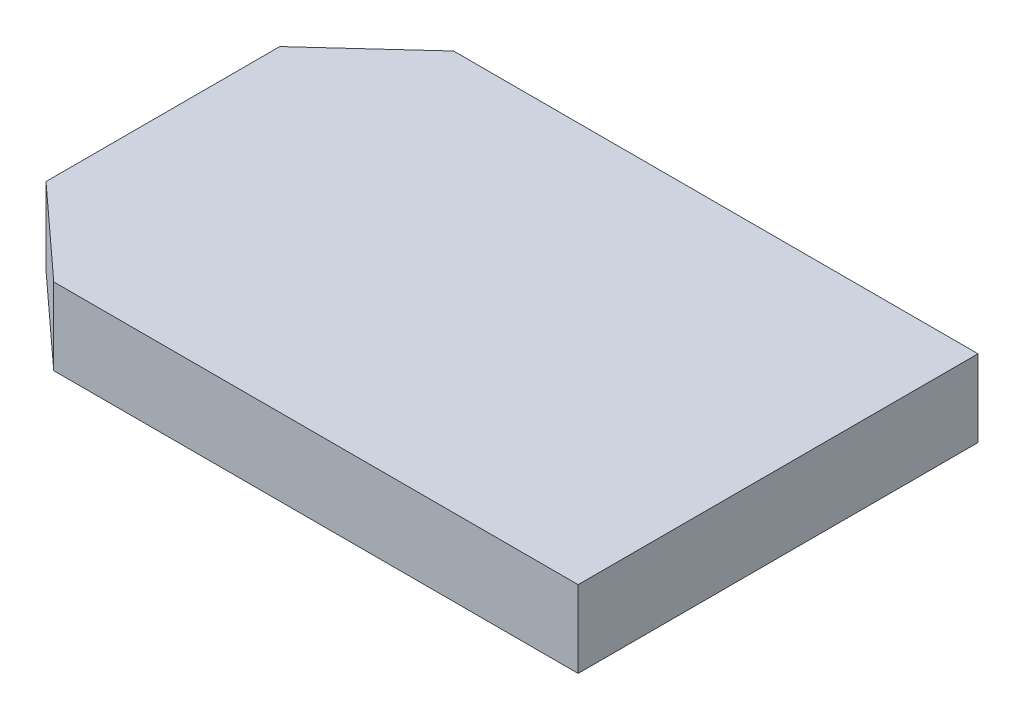
ISO-10303-21;
HEADER;
FILE_DESCRIPTION(('STEP AP214'),'2;1');
FILE_NAME('part.step','',(''),(''),'','','');
FILE_SCHEMA(('AUTOMOTIVE_DESIGN { 1 0 10303 214 1 1 1 1 }'));
ENDSEC;
DATA;
#1=APPLICATION_CONTEXT('core data for automotive mechanical design processes');
#2=APPLICATION_PROTOCOL_DEFINITION('international standard','automotive_design',2000,#1);
#3=PRODUCT_CONTEXT('',#1,'mechanical');
#4=PRODUCT('Part','Part','',(#3));
#5=PRODUCT_RELATED_PRODUCT_CATEGORY('part','',(#4));
#6=PRODUCT_DEFINITION_FORMATION('','',#4);
#7=PRODUCT_DEFINITION_CONTEXT('part definition',#1,'design');
#8=PRODUCT_DEFINITION('design','',#6,#7);
#9=PRODUCT_DEFINITION_SHAPE('','',#8);
#10=(LENGTH_UNIT() NAMED_UNIT(*) SI_UNIT(.MILLI.,.METRE.));
#11=(NAMED_UNIT(*) PLANE_ANGLE_UNIT() SI_UNIT($,.RADIAN.));
#12=(NAMED_UNIT(*) SI_UNIT($,.STERADIAN.) SOLID_ANGLE_UNIT());
#13=UNCERTAINTY_MEASURE_WITH_UNIT(LENGTH_MEASURE(1.E-05),#10,'distance_accuracy_value','');
#14=(GEOMETRIC_REPRESENTATION_CONTEXT(3) GLOBAL_UNCERTAINTY_ASSIGNED_CONTEXT((#13)) GLOBAL_UNIT_ASSIGNED_CONTEXT((#10,
#11,#12)) REPRESENTATION_CONTEXT('',''));
#15=CARTESIAN_POINT('',(0.,0.,0.));
#16=DIRECTION('',(0.,0.,1.));
#17=DIRECTION('',(1.,0.,0.));
#18=AXIS2_PLACEMENT_3D('',#15,#16,#17);
#19=CARTESIAN_POINT('',(-127.,31.75,-48.26));
#20=DIRECTION('',(0.675,0.,0.737817728168685));
#21=DIRECTION('',(0.737817728168685,0.,-0.675));
#22=AXIS2_PLACEMENT_3D('',#19,#20,#21);
#23=PLANE('',#22);
#24=DIRECTION('',(-0.737817728168685,0.,0.675));
#25=VECTOR('',#24,1.);
#26=CARTESIAN_POINT('',(-127.,0.,-48.26));
#27=LINE('',#26,#25);
#28=CARTESIAN_POINT('',(-89.5188594090308,0.,-82.55));
#29=VERTEX_POINT('',#28);
#30=CARTESIAN_POINT('',(-127.,0.,-48.26));
#31=VERTEX_POINT('',#30);
#32=EDGE_CURVE('E117',#29,#31,#27,.T.);
#33=ORIENTED_EDGE('',*,*,#32,.T.);
#34=DIRECTION('',(0.,-1.,0.));
#35=VECTOR('',#34,1.);
#36=CARTESIAN_POINT('',(-127.,31.75,-48.26));
#37=LINE('',#36,#35);
#38=CARTESIAN_POINT('',(-127.,31.75,-48.26));
#39=VERTEX_POINT('',#38);
#40=EDGE_CURVE('E11',#39,#31,#37,.T.);
#41=ORIENTED_EDGE('',*,*,#40,.F.);
#42=DIRECTION('',(-0.737817728168685,0.,0.675));
#43=VECTOR('',#42,1.);
#44=CARTESIAN_POINT('',(-127.,31.75,-48.26));
#45=LINE('',#44,#43);
#46=CARTESIAN_POINT('',(-89.5188594090308,31.75,-82.55));
#47=VERTEX_POINT('',#46);
#48=EDGE_CURVE('E127',#47,#39,#45,.T.);
#49=ORIENTED_EDGE('',*,*,#48,.F.);
#50=DIRECTION('',(0.,-1.,0.));
#51=VECTOR('',#50,1.);
#52=CARTESIAN_POINT('',(-89.5188594090308,31.75,-82.55));
#53=LINE('',#52,#51);
#54=EDGE_CURVE('E113',#47,#29,#53,.T.);
#55=ORIENTED_EDGE('',*,*,#54,.T.);
#56=EDGE_LOOP('',(#33,#41,#49,#55));
#57=FACE_BOUND('',#56,.T.);
#58=ADVANCED_FACE('F33',(#57),#23,.F.);
#59=CARTESIAN_POINT('',(-127.,31.75,48.26));
#60=DIRECTION('',(1.,0.,0.));
#61=DIRECTION('',(0.,0.,-1.));
#62=AXIS2_PLACEMENT_3D('',#59,#60,#61);
#63=PLANE('',#62);
#64=DIRECTION('',(0.,0.,1.));
#65=VECTOR('',#64,1.);
#66=CARTESIAN_POINT('',(-127.,0.,48.26));
#67=LINE('',#66,#65);
#68=CARTESIAN_POINT('',(-127.,0.,48.26));
#69=VERTEX_POINT('',#68);
#70=EDGE_CURVE('E120',#31,#69,#67,.T.);
#71=ORIENTED_EDGE('',*,*,#70,.T.);
#72=DIRECTION('',(0.,-1.,0.));
#73=VECTOR('',#72,1.);
#74=CARTESIAN_POINT('',(-127.,31.75,48.26));
#75=LINE('',#74,#73);
#76=CARTESIAN_POINT('',(-127.,31.75,48.26));
#77=VERTEX_POINT('',#76);
#78=EDGE_CURVE('E41',#77,#69,#75,.T.);
#79=ORIENTED_EDGE('',*,*,#78,.F.);
#80=DIRECTION('',(0.,0.,1.));
#81=VECTOR('',#80,1.);
#82=CARTESIAN_POINT('',(-127.,31.75,48.26));
#83=LINE('',#82,#81);
#84=EDGE_CURVE('E86',#39,#77,#83,.T.);
#85=ORIENTED_EDGE('',*,*,#84,.F.);
#86=ORIENTED_EDGE('',*,*,#40,.T.);
#87=EDGE_LOOP('',(#71,#79,#85,#86));
#88=FACE_BOUND('',#87,.T.);
#89=ADVANCED_FACE('F151',(#88),#63,.F.);
#90=CARTESIAN_POINT('',(-127.,31.75,48.26));
#91=DIRECTION('',(0.675,0.,-0.737817728168685));
#92=DIRECTION('',(-0.737817728168685,0.,-0.675));
#93=AXIS2_PLACEMENT_3D('',#90,#91,#92);
#94=PLANE('',#93);
#95=DIRECTION('',(0.737817728168685,0.,0.675));
#96=VECTOR('',#95,1.);
#97=CARTESIAN_POINT('',(-127.,0.,48.26));
#98=LINE('',#97,#96);
#99=CARTESIAN_POINT('',(-89.5188594090308,0.,82.55));
#100=VERTEX_POINT('',#99);
#101=EDGE_CURVE('E122',#69,#100,#98,.T.);
#102=ORIENTED_EDGE('',*,*,#101,.T.);
#103=DIRECTION('',(0.,-1.,0.));
#104=VECTOR('',#103,1.);
#105=CARTESIAN_POINT('',(-89.5188594090308,31.75,82.55));
#106=LINE('',#105,#104);
#107=CARTESIAN_POINT('',(-89.5188594090308,31.75,82.55));
#108=VERTEX_POINT('',#107);
#109=EDGE_CURVE('E108',#108,#100,#106,.T.);
#110=ORIENTED_EDGE('',*,*,#109,.F.);
#111=DIRECTION('',(0.737817728168685,0.,0.675));
#112=VECTOR('',#111,1.);
#113=CARTESIAN_POINT('',(-127.,31.75,48.26));
#114=LINE('',#113,#112);
#115=EDGE_CURVE('E99',#77,#108,#114,.T.);
#116=ORIENTED_EDGE('',*,*,#115,.F.);
#117=ORIENTED_EDGE('',*,*,#78,.T.);
#118=EDGE_LOOP('',(#102,#110,#116,#117));
#119=FACE_BOUND('',#118,.T.);
#120=ADVANCED_FACE('F133',(#119),#94,.F.);
#121=CARTESIAN_POINT('',(-89.5188594090308,31.75,82.55));
#122=DIRECTION('',(0.,0.,-1.));
#123=DIRECTION('',(-1.,0.,0.));
#124=AXIS2_PLACEMENT_3D('',#121,#122,#123);
#125=PLANE('',#124);
#126=DIRECTION('',(1.,0.,0.));
#127=VECTOR('',#126,1.);
#128=CARTESIAN_POINT('',(-89.5188594090308,0.,82.55));
#129=LINE('',#128,#127);
#130=CARTESIAN_POINT('',(127.,0.,82.55));
#131=VERTEX_POINT('',#130);
#132=EDGE_CURVE('E107',#100,#131,#129,.T.);
#133=ORIENTED_EDGE('',*,*,#132,.T.);
#134=DIRECTION('',(0.,-1.,0.));
#135=VECTOR('',#134,1.);
#136=CARTESIAN_POINT('',(127.,31.75,82.55));
#137=LINE('',#136,#135);
#138=CARTESIAN_POINT('',(127.,31.75,82.55));
#139=VERTEX_POINT('',#138);
#140=EDGE_CURVE('E104',#139,#131,#137,.T.);
#141=ORIENTED_EDGE('',*,*,#140,.F.);
#142=DIRECTION('',(1.,0.,0.));
#143=VECTOR('',#142,1.);
#144=CARTESIAN_POINT('',(-89.5188594090308,31.75,82.55));
#145=LINE('',#144,#143);
#146=EDGE_CURVE('E93',#108,#139,#145,.T.);
#147=ORIENTED_EDGE('',*,*,#146,.F.);
#148=ORIENTED_EDGE('',*,*,#109,.T.);
#149=EDGE_LOOP('',(#133,#141,#147,#148));
#150=FACE_BOUND('',#149,.T.);
#151=ADVANCED_FACE('F105',(#150),#125,.F.);
#152=CARTESIAN_POINT('',(127.,31.75,-82.55));
#153=DIRECTION('',(-1.,0.,0.));
#154=DIRECTION('',(0.,0.,1.));
#155=AXIS2_PLACEMENT_3D('',#152,#153,#154);
#156=PLANE('',#155);
#157=DIRECTION('',(0.,0.,-1.));
#158=VECTOR('',#157,1.);
#159=CARTESIAN_POINT('',(127.,0.,-82.55));
#160=LINE('',#159,#158);
#161=CARTESIAN_POINT('',(127.,0.,-82.55));
#162=VERTEX_POINT('',#161);
#163=EDGE_CURVE('E72',#131,#162,#160,.T.);
#164=ORIENTED_EDGE('',*,*,#163,.T.);
#165=DIRECTION('',(0.,-1.,0.));
#166=VECTOR('',#165,1.);
#167=CARTESIAN_POINT('',(127.,31.75,-82.55));
#168=LINE('',#167,#166);
#169=CARTESIAN_POINT('',(127.,31.75,-82.55));
#170=VERTEX_POINT('',#169);
#171=EDGE_CURVE('E109',#170,#162,#168,.T.);
#172=ORIENTED_EDGE('',*,*,#171,.F.);
#173=DIRECTION('',(0.,0.,-1.));
#174=VECTOR('',#173,1.);
#175=CARTESIAN_POINT('',(127.,31.75,-82.55));
#176=LINE('',#175,#174);
#177=EDGE_CURVE('E97',#139,#170,#176,.T.);
#178=ORIENTED_EDGE('',*,*,#177,.F.);
#179=ORIENTED_EDGE('',*,*,#140,.T.);
#180=EDGE_LOOP('',(#164,#172,#178,#179));
#181=FACE_BOUND('',#180,.T.);
#182=ADVANCED_FACE('F111',(#181),#156,.F.);
#183=CARTESIAN_POINT('',(-89.5188594090308,31.75,-82.55));
#184=DIRECTION('',(0.,0.,1.));
#185=DIRECTION('',(1.,0.,0.));
#186=AXIS2_PLACEMENT_3D('',#183,#184,#185);
#187=PLANE('',#186);
#188=DIRECTION('',(-1.,0.,0.));
#189=VECTOR('',#188,1.);
#190=CARTESIAN_POINT('',(-89.5188594090308,0.,-82.55));
#191=LINE('',#190,#189);
#192=EDGE_CURVE('E78',#162,#29,#191,.T.);
#193=ORIENTED_EDGE('',*,*,#192,.T.);
#194=ORIENTED_EDGE('',*,*,#54,.F.);
#195=DIRECTION('',(-1.,0.,0.));
#196=VECTOR('',#195,1.);
#197=CARTESIAN_POINT('',(-89.5188594090308,31.75,-82.55));
#198=LINE('',#197,#196);
#199=EDGE_CURVE('E49',#170,#47,#198,.T.);
#200=ORIENTED_EDGE('',*,*,#199,.F.);
#201=ORIENTED_EDGE('',*,*,#171,.T.);
#202=EDGE_LOOP('',(#193,#194,#200,#201));
#203=FACE_BOUND('',#202,.T.);
#204=ADVANCED_FACE('F140',(#203),#187,.F.);
#205=CARTESIAN_POINT('',(-179.751234905809,31.75,0.));
#206=DIRECTION('',(0.,-1.,0.));
#207=DIRECTION('',(0.,0.,-1.));
#208=AXIS2_PLACEMENT_3D('',#205,#206,#207);
#209=PLANE('',#208);
#210=ORIENTED_EDGE('',*,*,#48,.T.);
#211=ORIENTED_EDGE('',*,*,#84,.T.);
#212=ORIENTED_EDGE('',*,*,#115,.T.);
#213=ORIENTED_EDGE('',*,*,#146,.T.);
#214=ORIENTED_EDGE('',*,*,#177,.T.);
#215=ORIENTED_EDGE('',*,*,#199,.T.);
#216=EDGE_LOOP('',(#210,#211,#212,#213,#214,#215));
#217=FACE_BOUND('',#216,.T.);
#218=ADVANCED_FACE('F95',(#217),#209,.F.);
#219=CARTESIAN_POINT('',(-179.751234905809,0.,0.));
#220=DIRECTION('',(0.,-1.,0.));
#221=DIRECTION('',(0.,0.,-1.));
#222=AXIS2_PLACEMENT_3D('',#219,#220,#221);
#223=PLANE('',#222);
#224=ORIENTED_EDGE('',*,*,#32,.F.);
#225=ORIENTED_EDGE('',*,*,#192,.F.);
#226=ORIENTED_EDGE('',*,*,#163,.F.);
#227=ORIENTED_EDGE('',*,*,#132,.F.);
#228=ORIENTED_EDGE('',*,*,#101,.F.);
#229=ORIENTED_EDGE('',*,*,#70,.F.);
#230=EDGE_LOOP('',(#224,#225,#226,#227,#228,#229));
#231=FACE_BOUND('',#230,.T.);
#232=ADVANCED_FACE('F136',(#231),#223,.T.);
#233=CLOSED_SHELL('',(#58,#89,#120,#151,#182,#204,#218,#232));
#234=MANIFOLD_SOLID_BREP('B2',#233);
#235=ADVANCED_BREP_SHAPE_REPRESENTATION('',(#18,#234),#14);
#236=SHAPE_DEFINITION_REPRESENTATION(#9,#235);
ENDSEC;
END-ISO-10303-21;
